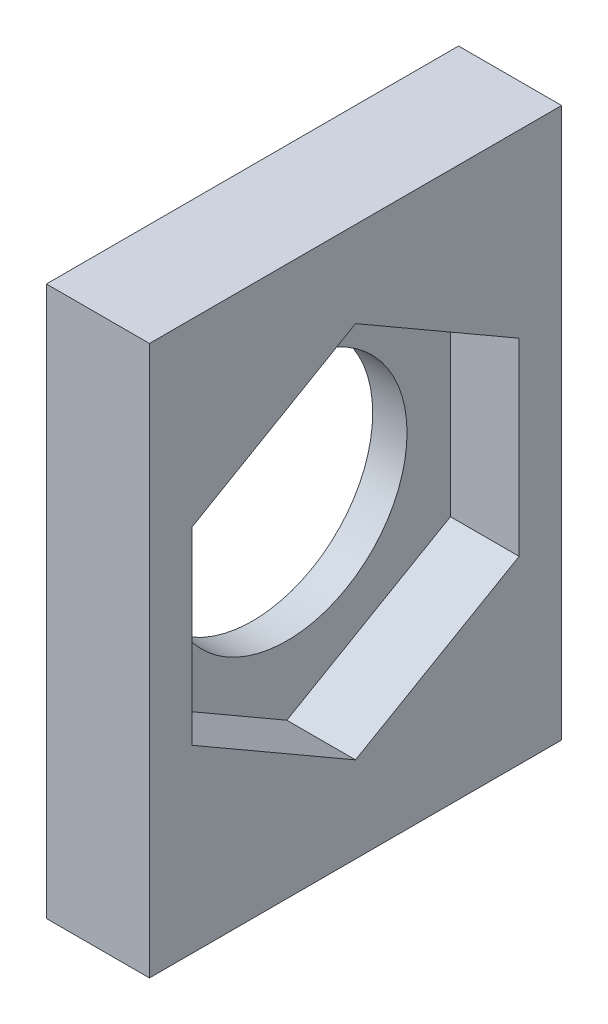
ISO-10303-21;
HEADER;
FILE_DESCRIPTION(('STEP AP214'),'2;1');
FILE_NAME('part.step','',(''),(''),'','','');
FILE_SCHEMA(('AUTOMOTIVE_DESIGN { 1 0 10303 214 1 1 1 1 }'));
ENDSEC;
DATA;
#1=APPLICATION_CONTEXT('core data for automotive mechanical design processes');
#2=APPLICATION_PROTOCOL_DEFINITION('international standard','automotive_design',2000,#1);
#3=PRODUCT_CONTEXT('',#1,'mechanical');
#4=PRODUCT('Part','Part','',(#3));
#5=PRODUCT_RELATED_PRODUCT_CATEGORY('part','',(#4));
#6=PRODUCT_DEFINITION_FORMATION('','',#4);
#7=PRODUCT_DEFINITION_CONTEXT('part definition',#1,'design');
#8=PRODUCT_DEFINITION('design','',#6,#7);
#9=PRODUCT_DEFINITION_SHAPE('','',#8);
#10=(LENGTH_UNIT() NAMED_UNIT(*) SI_UNIT(.MILLI.,.METRE.));
#11=(NAMED_UNIT(*) PLANE_ANGLE_UNIT() SI_UNIT($,.RADIAN.));
#12=(NAMED_UNIT(*) SI_UNIT($,.STERADIAN.) SOLID_ANGLE_UNIT());
#13=UNCERTAINTY_MEASURE_WITH_UNIT(LENGTH_MEASURE(1.E-05),#10,'distance_accuracy_value','');
#14=(GEOMETRIC_REPRESENTATION_CONTEXT(3) GLOBAL_UNCERTAINTY_ASSIGNED_CONTEXT((#13)) GLOBAL_UNIT_ASSIGNED_CONTEXT((#10,
#11,#12)) REPRESENTATION_CONTEXT('',''));
#15=CARTESIAN_POINT('',(0.,0.,0.));
#16=DIRECTION('',(0.,0.,1.));
#17=DIRECTION('',(1.,0.,0.));
#18=AXIS2_PLACEMENT_3D('',#15,#16,#17);
#19=CARTESIAN_POINT('',(0.,6.,-6.));
#20=DIRECTION('',(1.,0.,0.));
#21=DIRECTION('',(0.,0.,-1.));
#22=AXIS2_PLACEMENT_3D('',#19,#20,#21);
#23=CYLINDRICAL_SURFACE('',#22,3.5);
#24=CARTESIAN_POINT('',(0.,6.,-6.));
#25=DIRECTION('',(1.,0.,0.));
#26=DIRECTION('',(0.,0.,-1.));
#27=AXIS2_PLACEMENT_3D('',#24,#25,#26);
#28=CIRCLE('',#27,3.5);
#29=CARTESIAN_POINT('',(0.,6.,-9.5));
#30=VERTEX_POINT('',#29);
#31=EDGE_CURVE('E147',#30,#30,#28,.T.);
#32=ORIENTED_EDGE('',*,*,#31,.F.);
#33=EDGE_LOOP('',(#32));
#34=FACE_BOUND('',#33,.T.);
#35=CARTESIAN_POINT('',(1.,6.,-6.));
#36=DIRECTION('',(1.,0.,0.));
#37=DIRECTION('',(0.,0.,-1.));
#38=AXIS2_PLACEMENT_3D('',#35,#36,#37);
#39=CIRCLE('',#38,3.5);
#40=CARTESIAN_POINT('',(1.,6.,-9.5));
#41=VERTEX_POINT('',#40);
#42=EDGE_CURVE('E37',#41,#41,#39,.F.);
#43=ORIENTED_EDGE('',*,*,#42,.F.);
#44=EDGE_LOOP('',(#43));
#45=FACE_BOUND('',#44,.T.);
#46=ADVANCED_FACE('F33',(#34,#45),#23,.F.);
#47=CARTESIAN_POINT('',(3.,0.,0.));
#48=DIRECTION('',(0.,0.,-1.));
#49=DIRECTION('',(-1.,0.,0.));
#50=AXIS2_PLACEMENT_3D('',#47,#48,#49);
#51=PLANE('',#50);
#52=DIRECTION('',(0.,-1.,0.));
#53=VECTOR('',#52,1.);
#54=CARTESIAN_POINT('',(0.,0.,0.));
#55=LINE('',#54,#53);
#56=CARTESIAN_POINT('',(0.,14.,0.));
#57=VERTEX_POINT('',#56);
#58=CARTESIAN_POINT('',(0.,-2.,0.));
#59=VERTEX_POINT('',#58);
#60=EDGE_CURVE('E150',#57,#59,#55,.T.);
#61=ORIENTED_EDGE('',*,*,#60,.T.);
#62=DIRECTION('',(-1.,0.,0.));
#63=VECTOR('',#62,1.);
#64=CARTESIAN_POINT('',(3.,-2.,0.));
#65=LINE('',#64,#63);
#66=CARTESIAN_POINT('',(3.,-2.,0.));
#67=VERTEX_POINT('',#66);
#68=EDGE_CURVE('E338',#67,#59,#65,.T.);
#69=ORIENTED_EDGE('',*,*,#68,.F.);
#70=DIRECTION('',(0.,-1.,0.));
#71=VECTOR('',#70,1.);
#72=CARTESIAN_POINT('',(3.,0.,0.));
#73=LINE('',#72,#71);
#74=CARTESIAN_POINT('',(3.,14.,0.));
#75=VERTEX_POINT('',#74);
#76=EDGE_CURVE('E42',#75,#67,#73,.T.);
#77=ORIENTED_EDGE('',*,*,#76,.F.);
#78=DIRECTION('',(1.,0.,0.));
#79=VECTOR('',#78,1.);
#80=CARTESIAN_POINT('',(0.,14.,0.));
#81=LINE('',#80,#79);
#82=EDGE_CURVE('E184',#57,#75,#81,.T.);
#83=ORIENTED_EDGE('',*,*,#82,.F.);
#84=EDGE_LOOP('',(#61,#69,#77,#83));
#85=FACE_BOUND('',#84,.T.);
#86=ADVANCED_FACE('F35',(#85),#51,.F.);
#87=CARTESIAN_POINT('',(3.,0.,-12.));
#88=DIRECTION('',(0.,0.,1.));
#89=DIRECTION('',(1.,0.,0.));
#90=AXIS2_PLACEMENT_3D('',#87,#88,#89);
#91=PLANE('',#90);
#92=DIRECTION('',(0.,1.,0.));
#93=VECTOR('',#92,1.);
#94=CARTESIAN_POINT('',(0.,0.,-12.));
#95=LINE('',#94,#93);
#96=CARTESIAN_POINT('',(0.,-2.,-12.));
#97=VERTEX_POINT('',#96);
#98=CARTESIAN_POINT('',(0.,14.,-12.));
#99=VERTEX_POINT('',#98);
#100=EDGE_CURVE('E152',#97,#99,#95,.T.);
#101=ORIENTED_EDGE('',*,*,#100,.T.);
#102=DIRECTION('',(-1.,0.,0.));
#103=VECTOR('',#102,1.);
#104=CARTESIAN_POINT('',(0.,14.,-12.));
#105=LINE('',#104,#103);
#106=CARTESIAN_POINT('',(3.,14.,-12.));
#107=VERTEX_POINT('',#106);
#108=EDGE_CURVE('E129',#107,#99,#105,.T.);
#109=ORIENTED_EDGE('',*,*,#108,.F.);
#110=DIRECTION('',(0.,1.,0.));
#111=VECTOR('',#110,1.);
#112=CARTESIAN_POINT('',(3.,0.,-12.));
#113=LINE('',#112,#111);
#114=CARTESIAN_POINT('',(3.,-2.,-12.));
#115=VERTEX_POINT('',#114);
#116=EDGE_CURVE('E11',#115,#107,#113,.T.);
#117=ORIENTED_EDGE('',*,*,#116,.F.);
#118=DIRECTION('',(1.,0.,0.));
#119=VECTOR('',#118,1.);
#120=CARTESIAN_POINT('',(3.,-2.,-12.));
#121=LINE('',#120,#119);
#122=EDGE_CURVE('E166',#97,#115,#121,.T.);
#123=ORIENTED_EDGE('',*,*,#122,.F.);
#124=EDGE_LOOP('',(#101,#109,#117,#123));
#125=FACE_BOUND('',#124,.T.);
#126=ADVANCED_FACE('F161',(#125),#91,.F.);
#127=CARTESIAN_POINT('',(3.,0.,0.));
#128=DIRECTION('',(-1.,0.,0.));
#129=DIRECTION('',(0.,0.,1.));
#130=AXIS2_PLACEMENT_3D('',#127,#128,#129);
#131=PLANE('',#130);
#132=DIRECTION('',(0.,-0.5,0.866025403784439));
#133=VECTOR('',#132,1.);
#134=CARTESIAN_POINT('',(3.,11.5,-6.));
#135=LINE('',#134,#133);
#136=CARTESIAN_POINT('',(3.,11.5,-6.));
#137=VERTEX_POINT('',#136);
#138=CARTESIAN_POINT('',(3.,8.75,-1.23686027918559));
#139=VERTEX_POINT('',#138);
#140=EDGE_CURVE('E128',#137,#139,#135,.T.);
#141=ORIENTED_EDGE('',*,*,#140,.F.);
#142=DIRECTION('',(0.,0.5,0.866025403784439));
#143=VECTOR('',#142,1.);
#144=CARTESIAN_POINT('',(3.,8.75,-10.7631397208144));
#145=LINE('',#144,#143);
#146=CARTESIAN_POINT('',(3.,8.75,-10.7631397208144));
#147=VERTEX_POINT('',#146);
#148=EDGE_CURVE('E50',#147,#137,#145,.T.);
#149=ORIENTED_EDGE('',*,*,#148,.F.);
#150=DIRECTION('',(0.,1.,0.));
#151=VECTOR('',#150,1.);
#152=CARTESIAN_POINT('',(3.,3.25,-10.7631397208144));
#153=LINE('',#152,#151);
#154=CARTESIAN_POINT('',(3.,3.25,-10.7631397208144));
#155=VERTEX_POINT('',#154);
#156=EDGE_CURVE('E138',#155,#147,#153,.T.);
#157=ORIENTED_EDGE('',*,*,#156,.F.);
#158=DIRECTION('',(0.,0.5,-0.866025403784439));
#159=VECTOR('',#158,1.);
#160=CARTESIAN_POINT('',(3.,0.500000000000002,-6.));
#161=LINE('',#160,#159);
#162=CARTESIAN_POINT('',(3.,0.500000000000002,-6.));
#163=VERTEX_POINT('',#162);
#164=EDGE_CURVE('E136',#163,#155,#161,.T.);
#165=ORIENTED_EDGE('',*,*,#164,.F.);
#166=DIRECTION('',(0.,-0.5,-0.866025403784439));
#167=VECTOR('',#166,1.);
#168=CARTESIAN_POINT('',(3.,3.25,-1.23686027918559));
#169=LINE('',#168,#167);
#170=CARTESIAN_POINT('',(3.,3.25,-1.23686027918559));
#171=VERTEX_POINT('',#170);
#172=EDGE_CURVE('E101',#171,#163,#169,.T.);
#173=ORIENTED_EDGE('',*,*,#172,.F.);
#174=DIRECTION('',(0.,-1.,0.));
#175=VECTOR('',#174,1.);
#176=CARTESIAN_POINT('',(3.,8.75,-1.23686027918559));
#177=LINE('',#176,#175);
#178=EDGE_CURVE('E132',#139,#171,#177,.T.);
#179=ORIENTED_EDGE('',*,*,#178,.F.);
#180=EDGE_LOOP('',(#141,#149,#157,#165,#173,#179));
#181=FACE_BOUND('',#180,.T.);
#182=ORIENTED_EDGE('',*,*,#76,.T.);
#183=DIRECTION('',(0.,0.,1.));
#184=VECTOR('',#183,1.);
#185=CARTESIAN_POINT('',(3.,-2.,-12.));
#186=LINE('',#185,#184);
#187=EDGE_CURVE('E335',#115,#67,#186,.T.);
#188=ORIENTED_EDGE('',*,*,#187,.F.);
#189=ORIENTED_EDGE('',*,*,#116,.T.);
#190=DIRECTION('',(0.,0.,-1.));
#191=VECTOR('',#190,1.);
#192=CARTESIAN_POINT('',(3.,14.,0.));
#193=LINE('',#192,#191);
#194=EDGE_CURVE('E179',#75,#107,#193,.T.);
#195=ORIENTED_EDGE('',*,*,#194,.F.);
#196=EDGE_LOOP('',(#182,#188,#189,#195));
#197=FACE_BOUND('',#196,.T.);
#198=ADVANCED_FACE('F199',(#181,#197),#131,.F.);
#199=CARTESIAN_POINT('',(0.,0.,0.));
#200=DIRECTION('',(-1.,0.,0.));
#201=DIRECTION('',(0.,0.,1.));
#202=AXIS2_PLACEMENT_3D('',#199,#200,#201);
#203=PLANE('',#202);
#204=ORIENTED_EDGE('',*,*,#31,.T.);
#205=EDGE_LOOP('',(#204));
#206=FACE_BOUND('',#205,.T.);
#207=ORIENTED_EDGE('',*,*,#60,.F.);
#208=DIRECTION('',(0.,0.,1.));
#209=VECTOR('',#208,1.);
#210=CARTESIAN_POINT('',(0.,14.,0.));
#211=LINE('',#210,#209);
#212=EDGE_CURVE('E177',#99,#57,#211,.T.);
#213=ORIENTED_EDGE('',*,*,#212,.F.);
#214=ORIENTED_EDGE('',*,*,#100,.F.);
#215=DIRECTION('',(0.,0.,-1.));
#216=VECTOR('',#215,1.);
#217=CARTESIAN_POINT('',(0.,-2.,-12.));
#218=LINE('',#217,#216);
#219=EDGE_CURVE('E187',#59,#97,#218,.T.);
#220=ORIENTED_EDGE('',*,*,#219,.F.);
#221=EDGE_LOOP('',(#207,#213,#214,#220));
#222=FACE_BOUND('',#221,.T.);
#223=ADVANCED_FACE('F182',(#206,#222),#203,.T.);
#224=CARTESIAN_POINT('',(1.,0.,0.));
#225=DIRECTION('',(1.,0.,0.));
#226=DIRECTION('',(0.,0.,-1.));
#227=AXIS2_PLACEMENT_3D('',#224,#225,#226);
#228=PLANE('',#227);
#229=DIRECTION('',(0.,0.5,0.866025403784439));
#230=VECTOR('',#229,1.);
#231=CARTESIAN_POINT('',(1.,8.75,-10.7631397208144));
#232=LINE('',#231,#230);
#233=CARTESIAN_POINT('',(1.,8.75,-10.7631397208144));
#234=VERTEX_POINT('',#233);
#235=CARTESIAN_POINT('',(1.,11.5,-6.));
#236=VERTEX_POINT('',#235);
#237=EDGE_CURVE('E140',#234,#236,#232,.T.);
#238=ORIENTED_EDGE('',*,*,#237,.T.);
#239=DIRECTION('',(0.,-0.5,0.866025403784439));
#240=VECTOR('',#239,1.);
#241=CARTESIAN_POINT('',(1.,11.5,-6.));
#242=LINE('',#241,#240);
#243=CARTESIAN_POINT('',(1.,8.75,-1.23686027918559));
#244=VERTEX_POINT('',#243);
#245=EDGE_CURVE('E122',#236,#244,#242,.T.);
#246=ORIENTED_EDGE('',*,*,#245,.T.);
#247=DIRECTION('',(0.,-1.,0.));
#248=VECTOR('',#247,1.);
#249=CARTESIAN_POINT('',(1.,8.75,-1.23686027918559));
#250=LINE('',#249,#248);
#251=CARTESIAN_POINT('',(1.,3.25,-1.23686027918559));
#252=VERTEX_POINT('',#251);
#253=EDGE_CURVE('E120',#244,#252,#250,.T.);
#254=ORIENTED_EDGE('',*,*,#253,.T.);
#255=DIRECTION('',(0.,-0.5,-0.866025403784439));
#256=VECTOR('',#255,1.);
#257=CARTESIAN_POINT('',(1.,3.25,-1.23686027918559));
#258=LINE('',#257,#256);
#259=CARTESIAN_POINT('',(1.,0.500000000000002,-6.));
#260=VERTEX_POINT('',#259);
#261=EDGE_CURVE('E98',#252,#260,#258,.T.);
#262=ORIENTED_EDGE('',*,*,#261,.T.);
#263=DIRECTION('',(0.,0.5,-0.866025403784439));
#264=VECTOR('',#263,1.);
#265=CARTESIAN_POINT('',(1.,0.500000000000002,-6.));
#266=LINE('',#265,#264);
#267=CARTESIAN_POINT('',(1.,3.25,-10.7631397208144));
#268=VERTEX_POINT('',#267);
#269=EDGE_CURVE('E109',#260,#268,#266,.T.);
#270=ORIENTED_EDGE('',*,*,#269,.T.);
#271=DIRECTION('',(0.,1.,0.));
#272=VECTOR('',#271,1.);
#273=CARTESIAN_POINT('',(1.,3.25,-10.7631397208144));
#274=LINE('',#273,#272);
#275=EDGE_CURVE('E113',#268,#234,#274,.T.);
#276=ORIENTED_EDGE('',*,*,#275,.T.);
#277=EDGE_LOOP('',(#238,#246,#254,#262,#270,#276));
#278=FACE_BOUND('',#277,.T.);
#279=ORIENTED_EDGE('',*,*,#42,.T.);
#280=EDGE_LOOP('',(#279));
#281=FACE_BOUND('',#280,.T.);
#282=ADVANCED_FACE('F116',(#278,#281),#228,.T.);
#283=CARTESIAN_POINT('',(1.,8.75,-10.7631397208144));
#284=DIRECTION('',(0.,0.866025403784439,-0.5));
#285=DIRECTION('',(0.,0.5,0.866025403784439));
#286=AXIS2_PLACEMENT_3D('',#283,#284,#285);
#287=PLANE('',#286);
#288=ORIENTED_EDGE('',*,*,#148,.T.);
#289=DIRECTION('',(1.,0.,0.));
#290=VECTOR('',#289,1.);
#291=CARTESIAN_POINT('',(1.,11.5,-6.));
#292=LINE('',#291,#290);
#293=EDGE_CURVE('E81',#236,#137,#292,.T.);
#294=ORIENTED_EDGE('',*,*,#293,.F.);
#295=ORIENTED_EDGE('',*,*,#237,.F.);
#296=DIRECTION('',(1.,0.,0.));
#297=VECTOR('',#296,1.);
#298=CARTESIAN_POINT('',(1.,8.75,-10.7631397208144));
#299=LINE('',#298,#297);
#300=EDGE_CURVE('E58',#234,#147,#299,.T.);
#301=ORIENTED_EDGE('',*,*,#300,.T.);
#302=EDGE_LOOP('',(#288,#294,#295,#301));
#303=FACE_BOUND('',#302,.T.);
#304=ADVANCED_FACE('F204',(#303),#287,.F.);
#305=CARTESIAN_POINT('',(1.,3.25,-10.7631397208144));
#306=DIRECTION('',(0.,0.,-1.));
#307=DIRECTION('',(-1.,0.,0.));
#308=AXIS2_PLACEMENT_3D('',#305,#306,#307);
#309=PLANE('',#308);
#310=ORIENTED_EDGE('',*,*,#156,.T.);
#311=ORIENTED_EDGE('',*,*,#300,.F.);
#312=ORIENTED_EDGE('',*,*,#275,.F.);
#313=DIRECTION('',(1.,0.,0.));
#314=VECTOR('',#313,1.);
#315=CARTESIAN_POINT('',(1.,3.25,-10.7631397208144));
#316=LINE('',#315,#314);
#317=EDGE_CURVE('E105',#268,#155,#316,.T.);
#318=ORIENTED_EDGE('',*,*,#317,.T.);
#319=EDGE_LOOP('',(#310,#311,#312,#318));
#320=FACE_BOUND('',#319,.T.);
#321=ADVANCED_FACE('F202',(#320),#309,.F.);
#322=CARTESIAN_POINT('',(1.,0.500000000000002,-6.));
#323=DIRECTION('',(0.,-0.866025403784438,-0.5));
#324=DIRECTION('',(0.,0.5,-0.866025403784439));
#325=AXIS2_PLACEMENT_3D('',#322,#323,#324);
#326=PLANE('',#325);
#327=ORIENTED_EDGE('',*,*,#164,.T.);
#328=ORIENTED_EDGE('',*,*,#317,.F.);
#329=ORIENTED_EDGE('',*,*,#269,.F.);
#330=DIRECTION('',(1.,0.,0.));
#331=VECTOR('',#330,1.);
#332=CARTESIAN_POINT('',(1.,0.500000000000002,-6.));
#333=LINE('',#332,#331);
#334=EDGE_CURVE('E94',#260,#163,#333,.T.);
#335=ORIENTED_EDGE('',*,*,#334,.T.);
#336=EDGE_LOOP('',(#327,#328,#329,#335));
#337=FACE_BOUND('',#336,.T.);
#338=ADVANCED_FACE('F110',(#337),#326,.F.);
#339=CARTESIAN_POINT('',(1.,3.25,-1.23686027918559));
#340=DIRECTION('',(0.,-0.866025403784439,0.5));
#341=DIRECTION('',(0.,-0.5,-0.866025403784439));
#342=AXIS2_PLACEMENT_3D('',#339,#340,#341);
#343=PLANE('',#342);
#344=ORIENTED_EDGE('',*,*,#172,.T.);
#345=ORIENTED_EDGE('',*,*,#334,.F.);
#346=ORIENTED_EDGE('',*,*,#261,.F.);
#347=DIRECTION('',(1.,0.,0.));
#348=VECTOR('',#347,1.);
#349=CARTESIAN_POINT('',(1.,3.25,-1.23686027918559));
#350=LINE('',#349,#348);
#351=EDGE_CURVE('E106',#252,#171,#350,.T.);
#352=ORIENTED_EDGE('',*,*,#351,.T.);
#353=EDGE_LOOP('',(#344,#345,#346,#352));
#354=FACE_BOUND('',#353,.T.);
#355=ADVANCED_FACE('F96',(#354),#343,.F.);
#356=CARTESIAN_POINT('',(1.,8.75,-1.23686027918559));
#357=DIRECTION('',(0.,0.,1.));
#358=DIRECTION('',(0.,-1.,0.));
#359=AXIS2_PLACEMENT_3D('',#356,#357,#358);
#360=PLANE('',#359);
#361=ORIENTED_EDGE('',*,*,#178,.T.);
#362=ORIENTED_EDGE('',*,*,#351,.F.);
#363=ORIENTED_EDGE('',*,*,#253,.F.);
#364=DIRECTION('',(1.,0.,0.));
#365=VECTOR('',#364,1.);
#366=CARTESIAN_POINT('',(1.,8.75,-1.23686027918559));
#367=LINE('',#366,#365);
#368=EDGE_CURVE('E144',#244,#139,#367,.T.);
#369=ORIENTED_EDGE('',*,*,#368,.T.);
#370=EDGE_LOOP('',(#361,#362,#363,#369));
#371=FACE_BOUND('',#370,.T.);
#372=ADVANCED_FACE('F197',(#371),#360,.F.);
#373=CARTESIAN_POINT('',(1.,11.5,-6.));
#374=DIRECTION('',(0.,0.866025403784439,0.5));
#375=DIRECTION('',(0.,-0.5,0.866025403784439));
#376=AXIS2_PLACEMENT_3D('',#373,#374,#375);
#377=PLANE('',#376);
#378=ORIENTED_EDGE('',*,*,#140,.T.);
#379=ORIENTED_EDGE('',*,*,#368,.F.);
#380=ORIENTED_EDGE('',*,*,#245,.F.);
#381=ORIENTED_EDGE('',*,*,#293,.T.);
#382=EDGE_LOOP('',(#378,#379,#380,#381));
#383=FACE_BOUND('',#382,.T.);
#384=ADVANCED_FACE('F193',(#383),#377,.F.);
#385=CARTESIAN_POINT('',(0.,14.,0.));
#386=DIRECTION('',(0.,-1.,0.));
#387=DIRECTION('',(0.,0.,-1.));
#388=AXIS2_PLACEMENT_3D('',#385,#386,#387);
#389=PLANE('',#388);
#390=ORIENTED_EDGE('',*,*,#212,.T.);
#391=ORIENTED_EDGE('',*,*,#82,.T.);
#392=ORIENTED_EDGE('',*,*,#194,.T.);
#393=ORIENTED_EDGE('',*,*,#108,.T.);
#394=EDGE_LOOP('',(#390,#391,#392,#393));
#395=FACE_BOUND('',#394,.T.);
#396=ADVANCED_FACE('F174',(#395),#389,.F.);
#397=CARTESIAN_POINT('',(0.,-2.,0.));
#398=DIRECTION('',(0.,-1.,0.));
#399=DIRECTION('',(0.,0.,-1.));
#400=AXIS2_PLACEMENT_3D('',#397,#398,#399);
#401=PLANE('',#400);
#402=ORIENTED_EDGE('',*,*,#187,.T.);
#403=ORIENTED_EDGE('',*,*,#68,.T.);
#404=ORIENTED_EDGE('',*,*,#219,.T.);
#405=ORIENTED_EDGE('',*,*,#122,.T.);
#406=EDGE_LOOP('',(#402,#403,#404,#405));
#407=FACE_BOUND('',#406,.T.);
#408=ADVANCED_FACE('F293',(#407),#401,.T.);
#409=CLOSED_SHELL('',(#46,#86,#126,#198,#223,#282,#304,#321,#338,#355,#372,#384,#396,#408));
#410=MANIFOLD_SOLID_BREP('B2',#409);
#411=ADVANCED_BREP_SHAPE_REPRESENTATION('',(#18,#410),#14);
#412=SHAPE_DEFINITION_REPRESENTATION(#9,#411);
ENDSEC;
END-ISO-10303-21;
